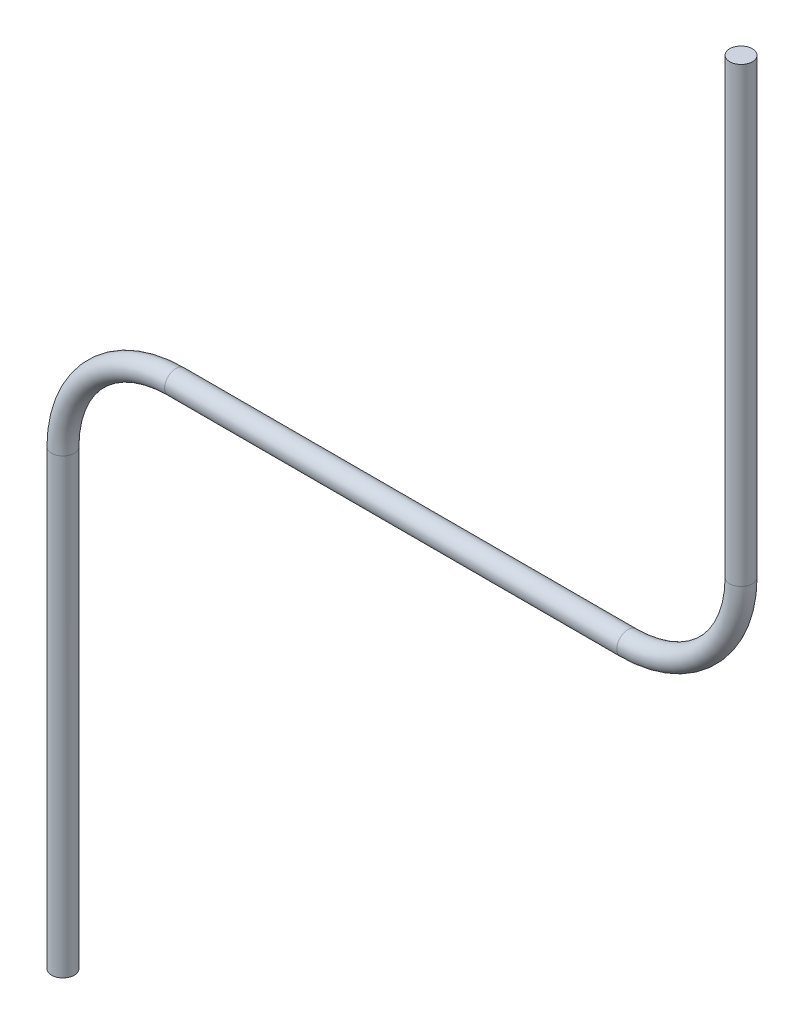
ISO-10303-21;
HEADER;
FILE_DESCRIPTION(('STEP AP214'),'2;1');
FILE_NAME('part.step','',(''),(''),'','','');
FILE_SCHEMA(('AUTOMOTIVE_DESIGN { 1 0 10303 214 1 1 1 1 }'));
ENDSEC;
DATA;
#1=APPLICATION_CONTEXT('core data for automotive mechanical design processes');
#2=APPLICATION_PROTOCOL_DEFINITION('international standard','automotive_design',2000,#1);
#3=PRODUCT_CONTEXT('',#1,'mechanical');
#4=PRODUCT('Part','Part','',(#3));
#5=PRODUCT_RELATED_PRODUCT_CATEGORY('part','',(#4));
#6=PRODUCT_DEFINITION_FORMATION('','',#4);
#7=PRODUCT_DEFINITION_CONTEXT('part definition',#1,'design');
#8=PRODUCT_DEFINITION('design','',#6,#7);
#9=PRODUCT_DEFINITION_SHAPE('','',#8);
#10=(LENGTH_UNIT() NAMED_UNIT(*) SI_UNIT(.MILLI.,.METRE.));
#11=(NAMED_UNIT(*) PLANE_ANGLE_UNIT() SI_UNIT($,.RADIAN.));
#12=(NAMED_UNIT(*) SI_UNIT($,.STERADIAN.) SOLID_ANGLE_UNIT());
#13=UNCERTAINTY_MEASURE_WITH_UNIT(LENGTH_MEASURE(1.E-05),#10,'distance_accuracy_value','');
#14=(GEOMETRIC_REPRESENTATION_CONTEXT(3) GLOBAL_UNCERTAINTY_ASSIGNED_CONTEXT((#13)) GLOBAL_UNIT_ASSIGNED_CONTEXT((#10,
#11,#12)) REPRESENTATION_CONTEXT('',''));
#15=CARTESIAN_POINT('',(0.,0.,0.));
#16=DIRECTION('',(0.,0.,1.));
#17=DIRECTION('',(1.,0.,0.));
#18=AXIS2_PLACEMENT_3D('',#15,#16,#17);
#19=CARTESIAN_POINT('',(0.,0.,0.));
#20=DIRECTION('',(0.,1.,0.));
#21=DIRECTION('',(0.,0.,1.));
#22=AXIS2_PLACEMENT_3D('',#19,#20,#21);
#23=PLANE('',#22);
#24=CARTESIAN_POINT('',(0.,0.,0.));
#25=DIRECTION('',(0.,1.,0.));
#26=DIRECTION('',(0.,0.,1.));
#27=AXIS2_PLACEMENT_3D('',#24,#25,#26);
#28=CIRCLE('',#27,2.);
#29=CARTESIAN_POINT('',(0.,0.,2.));
#30=VERTEX_POINT('',#29);
#31=EDGE_CURVE('E69',#30,#30,#28,.T.);
#32=ORIENTED_EDGE('',*,*,#31,.T.);
#33=EDGE_LOOP('',(#32));
#34=FACE_BOUND('',#33,.T.);
#35=ADVANCED_FACE('F41',(#34),#23,.T.);
#36=CARTESIAN_POINT('',(-120.,-200.,0.));
#37=DIRECTION('',(0.,1.,0.));
#38=DIRECTION('',(0.,0.,1.));
#39=AXIS2_PLACEMENT_3D('',#36,#37,#38);
#40=PLANE('',#39);
#41=CARTESIAN_POINT('',(-120.,-200.,0.));
#42=DIRECTION('',(0.,1.,0.));
#43=DIRECTION('',(0.,0.,1.));
#44=AXIS2_PLACEMENT_3D('',#41,#42,#43);
#45=CIRCLE('',#44,2.);
#46=CARTESIAN_POINT('',(-120.,-200.,2.));
#47=VERTEX_POINT('',#46);
#48=EDGE_CURVE('E10',#47,#47,#45,.T.);
#49=ORIENTED_EDGE('',*,*,#48,.F.);
#50=EDGE_LOOP('',(#49));
#51=FACE_BOUND('',#50,.T.);
#52=ADVANCED_FACE('F77',(#51),#40,.F.);
#53=CARTESIAN_POINT('',(0.,0.,0.));
#54=DIRECTION('',(0.,-1.,0.));
#55=DIRECTION('',(0.,0.,-1.));
#56=AXIS2_PLACEMENT_3D('',#53,#54,#55);
#57=CYLINDRICAL_SURFACE('',#56,2.);
#58=CARTESIAN_POINT('',(0.,-80.,0.));
#59=DIRECTION('',(0.,1.,0.));
#60=DIRECTION('',(0.,0.,1.));
#61=AXIS2_PLACEMENT_3D('',#58,#59,#60);
#62=CIRCLE('',#61,2.);
#63=CARTESIAN_POINT('',(2.00000000000001,-80.,0.));
#64=VERTEX_POINT('',#63);
#65=EDGE_CURVE('E65',#64,#64,#62,.T.);
#66=ORIENTED_EDGE('',*,*,#65,.T.);
#67=EDGE_LOOP('',(#66));
#68=FACE_BOUND('',#67,.T.);
#69=ORIENTED_EDGE('',*,*,#31,.F.);
#70=EDGE_LOOP('',(#69));
#71=FACE_BOUND('',#70,.T.);
#72=ADVANCED_FACE('F74',(#68,#71),#57,.T.);
#73=CARTESIAN_POINT('',(-20.,-80.,0.));
#74=DIRECTION('',(0.,0.,-1.));
#75=DIRECTION('',(-1.,0.,0.));
#76=AXIS2_PLACEMENT_3D('',#73,#74,#75);
#77=TOROIDAL_SURFACE('',#76,20.,2.);
#78=CARTESIAN_POINT('',(-20.,-100.,0.));
#79=DIRECTION('',(1.,0.,0.));
#80=DIRECTION('',(0.,0.,1.));
#81=AXIS2_PLACEMENT_3D('',#78,#79,#80);
#82=CIRCLE('',#81,2.);
#83=CARTESIAN_POINT('',(-20.,-102.,0.));
#84=VERTEX_POINT('',#83);
#85=EDGE_CURVE('E59',#84,#84,#82,.T.);
#86=CARTESIAN_POINT('',(-20.,-80.,0.));
#87=DIRECTION('',(0.,0.,-1.));
#88=DIRECTION('',(-1.,0.,0.));
#89=AXIS2_PLACEMENT_3D('',#86,#87,#88);
#90=CIRCLE('',#89,22.);
#91=EDGE_CURVE('',#64,#84,#90,.T.);
#92=ORIENTED_EDGE('',*,*,#65,.F.);
#93=ORIENTED_EDGE('',*,*,#85,.T.);
#94=ORIENTED_EDGE('',*,*,#91,.T.);
#95=ORIENTED_EDGE('',*,*,#91,.F.);
#96=EDGE_LOOP('',(#92,#94,#93,#95));
#97=FACE_BOUND('',#96,.T.);
#98=ADVANCED_FACE('F76',(#97),#77,.T.);
#99=CARTESIAN_POINT('',(-20.,-100.,0.));
#100=DIRECTION('',(-1.,0.,0.));
#101=DIRECTION('',(0.,0.,1.));
#102=AXIS2_PLACEMENT_3D('',#99,#100,#101);
#103=CYLINDRICAL_SURFACE('',#102,2.);
#104=CARTESIAN_POINT('',(-100.,-100.,0.));
#105=DIRECTION('',(1.,0.,0.));
#106=DIRECTION('',(0.,0.,1.));
#107=AXIS2_PLACEMENT_3D('',#104,#105,#106);
#108=CIRCLE('',#107,2.);
#109=CARTESIAN_POINT('',(-100.,-98.,0.));
#110=VERTEX_POINT('',#109);
#111=EDGE_CURVE('E54',#110,#110,#108,.T.);
#112=ORIENTED_EDGE('',*,*,#111,.T.);
#113=EDGE_LOOP('',(#112));
#114=FACE_BOUND('',#113,.T.);
#115=ORIENTED_EDGE('',*,*,#85,.F.);
#116=EDGE_LOOP('',(#115));
#117=FACE_BOUND('',#116,.T.);
#118=ADVANCED_FACE('F83',(#114,#117),#103,.T.);
#119=CARTESIAN_POINT('',(-100.,-120.,0.));
#120=DIRECTION('',(0.,0.,1.));
#121=DIRECTION('',(1.,0.,0.));
#122=AXIS2_PLACEMENT_3D('',#119,#120,#121);
#123=TOROIDAL_SURFACE('',#122,20.,2.);
#124=CARTESIAN_POINT('',(-120.,-120.,0.));
#125=DIRECTION('',(0.,1.,0.));
#126=DIRECTION('',(0.,0.,1.));
#127=AXIS2_PLACEMENT_3D('',#124,#125,#126);
#128=CIRCLE('',#127,2.);
#129=CARTESIAN_POINT('',(-122.,-120.,0.));
#130=VERTEX_POINT('',#129);
#131=EDGE_CURVE('E48',#130,#130,#128,.T.);
#132=CARTESIAN_POINT('',(-100.,-120.,0.));
#133=DIRECTION('',(0.,0.,1.));
#134=DIRECTION('',(1.,0.,0.));
#135=AXIS2_PLACEMENT_3D('',#132,#133,#134);
#136=CIRCLE('',#135,22.);
#137=EDGE_CURVE('',#110,#130,#136,.T.);
#138=ORIENTED_EDGE('',*,*,#111,.F.);
#139=ORIENTED_EDGE('',*,*,#131,.T.);
#140=ORIENTED_EDGE('',*,*,#137,.T.);
#141=ORIENTED_EDGE('',*,*,#137,.F.);
#142=EDGE_LOOP('',(#138,#140,#139,#141));
#143=FACE_BOUND('',#142,.T.);
#144=ADVANCED_FACE('F89',(#143),#123,.T.);
#145=CARTESIAN_POINT('',(-120.,-120.,0.));
#146=DIRECTION('',(0.,-1.,0.));
#147=DIRECTION('',(0.,0.,-1.));
#148=AXIS2_PLACEMENT_3D('',#145,#146,#147);
#149=CYLINDRICAL_SURFACE('',#148,2.);
#150=ORIENTED_EDGE('',*,*,#48,.T.);
#151=EDGE_LOOP('',(#150));
#152=FACE_BOUND('',#151,.T.);
#153=ORIENTED_EDGE('',*,*,#131,.F.);
#154=EDGE_LOOP('',(#153));
#155=FACE_BOUND('',#154,.T.);
#156=ADVANCED_FACE('F87',(#152,#155),#149,.T.);
#157=CLOSED_SHELL('',(#35,#52,#72,#98,#118,#144,#156));
#158=MANIFOLD_SOLID_BREP('B2',#157);
#159=ADVANCED_BREP_SHAPE_REPRESENTATION('',(#18,#158),#14);
#160=SHAPE_DEFINITION_REPRESENTATION(#9,#159);
ENDSEC;
END-ISO-10303-21;
